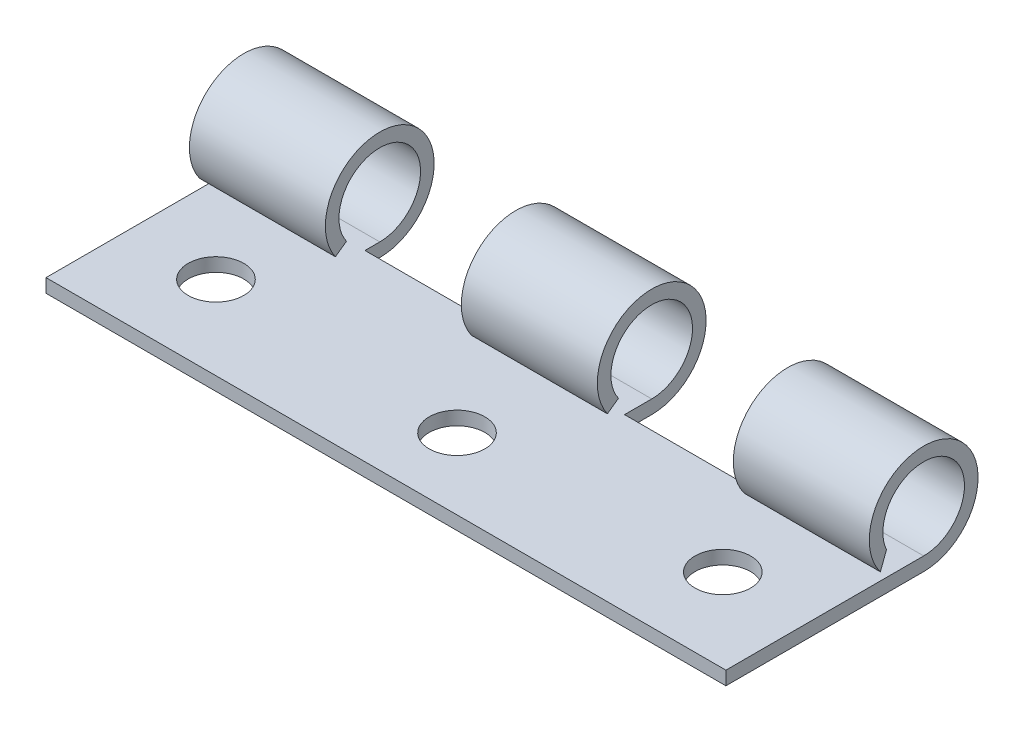
ISO-10303-21;
HEADER;
FILE_DESCRIPTION(('STEP AP214'),'2;1');
FILE_NAME('part.step','',(''),(''),'','','');
FILE_SCHEMA(('AUTOMOTIVE_DESIGN { 1 0 10303 214 1 1 1 1 }'));
ENDSEC;
DATA;
#1=APPLICATION_CONTEXT('core data for automotive mechanical design processes');
#2=APPLICATION_PROTOCOL_DEFINITION('international standard','automotive_design',2000,#1);
#3=PRODUCT_CONTEXT('',#1,'mechanical');
#4=PRODUCT('Part','Part','',(#3));
#5=PRODUCT_RELATED_PRODUCT_CATEGORY('part','',(#4));
#6=PRODUCT_DEFINITION_FORMATION('','',#4);
#7=PRODUCT_DEFINITION_CONTEXT('part definition',#1,'design');
#8=PRODUCT_DEFINITION('design','',#6,#7);
#9=PRODUCT_DEFINITION_SHAPE('','',#8);
#10=(LENGTH_UNIT() NAMED_UNIT(*) SI_UNIT(.MILLI.,.METRE.));
#11=(NAMED_UNIT(*) PLANE_ANGLE_UNIT() SI_UNIT($,.RADIAN.));
#12=(NAMED_UNIT(*) SI_UNIT($,.STERADIAN.) SOLID_ANGLE_UNIT());
#13=UNCERTAINTY_MEASURE_WITH_UNIT(LENGTH_MEASURE(1.E-05),#10,'distance_accuracy_value','');
#14=(GEOMETRIC_REPRESENTATION_CONTEXT(3) GLOBAL_UNCERTAINTY_ASSIGNED_CONTEXT((#13)) GLOBAL_UNIT_ASSIGNED_CONTEXT((#10,
#11,#12)) REPRESENTATION_CONTEXT('',''));
#15=CARTESIAN_POINT('',(0.,0.,0.));
#16=DIRECTION('',(0.,0.,1.));
#17=DIRECTION('',(1.,0.,0.));
#18=AXIS2_PLACEMENT_3D('',#15,#16,#17);
#19=CARTESIAN_POINT('',(12.0849999999999,4.4,-38.4175000000002));
#20=DIRECTION('',(1.,0.,0.));
#21=DIRECTION('',(0.,0.,-1.));
#22=AXIS2_PLACEMENT_3D('',#19,#20,#21);
#23=CYLINDRICAL_SURFACE('',#22,4.40000000000011);
#24=DIRECTION('',(1.,0.,0.));
#25=VECTOR('',#24,1.);
#26=CARTESIAN_POINT('',(12.0849999999999,1.85263157894761,-34.8298943740395));
#27=LINE('',#26,#25);
#28=CARTESIAN_POINT('',(12.0849999999999,1.85263157894761,-34.8298943740395));
#29=VERTEX_POINT('',#28);
#30=CARTESIAN_POINT('',(23.0849999999999,1.85263157894761,-34.8298943740395));
#31=VERTEX_POINT('',#30);
#32=EDGE_CURVE('E289',#29,#31,#27,.T.);
#33=ORIENTED_EDGE('',*,*,#32,.T.);
#34=CARTESIAN_POINT('',(23.0849999999999,4.4,-38.4175000000002));
#35=DIRECTION('',(1.,0.,0.));
#36=DIRECTION('',(0.,0.,-1.));
#37=AXIS2_PLACEMENT_3D('',#34,#35,#36);
#38=CIRCLE('',#37,4.40000000000011);
#39=CARTESIAN_POINT('',(23.0849999999999,0.,-38.4175000000001));
#40=VERTEX_POINT('',#39);
#41=EDGE_CURVE('E66',#31,#40,#38,.F.);
#42=ORIENTED_EDGE('',*,*,#41,.T.);
#43=DIRECTION('',(1.,0.,0.));
#44=VECTOR('',#43,1.);
#45=CARTESIAN_POINT('',(12.0849999999999,-2.22044604925031E-13,-38.4175));
#46=LINE('',#45,#44);
#47=CARTESIAN_POINT('',(12.0849999999999,-2.22044604925031E-13,-38.4175));
#48=VERTEX_POINT('',#47);
#49=EDGE_CURVE('E274',#48,#40,#46,.T.);
#50=ORIENTED_EDGE('',*,*,#49,.F.);
#51=CARTESIAN_POINT('',(12.0849999999999,4.4,-38.4175000000002));
#52=DIRECTION('',(1.,0.,0.));
#53=DIRECTION('',(0.,0.,-1.));
#54=AXIS2_PLACEMENT_3D('',#51,#52,#53);
#55=CIRCLE('',#54,4.40000000000011);
#56=EDGE_CURVE('E244',#48,#29,#55,.T.);
#57=ORIENTED_EDGE('',*,*,#56,.T.);
#58=EDGE_LOOP('',(#33,#42,#50,#57));
#59=FACE_BOUND('',#58,.T.);
#60=ADVANCED_FACE('F43',(#59),#23,.T.);
#61=CARTESIAN_POINT('',(12.0849999999999,4.4,-38.4175000000002));
#62=DIRECTION('',(1.,0.,0.));
#63=DIRECTION('',(0.,0.,-1.));
#64=AXIS2_PLACEMENT_3D('',#61,#62,#63);
#65=CYLINDRICAL_SURFACE('',#64,3.3);
#66=CARTESIAN_POINT('',(23.0849999999999,4.40000000000005,-38.4175000000003));
#67=DIRECTION('',(1.,0.,0.));
#68=DIRECTION('',(0.,0.,-1.));
#69=AXIS2_PLACEMENT_3D('',#66,#67,#68);
#70=CIRCLE('',#69,3.3);
#71=CARTESIAN_POINT('',(23.0849999999999,1.10000000000005,-38.4175000000003));
#72=VERTEX_POINT('',#71);
#73=CARTESIAN_POINT('',(23.0849999999999,2.48947368421077,-35.7267957805296));
#74=VERTEX_POINT('',#73);
#75=EDGE_CURVE('E230',#72,#74,#70,.T.);
#76=ORIENTED_EDGE('',*,*,#75,.T.);
#77=DIRECTION('',(1.,0.,0.));
#78=VECTOR('',#77,1.);
#79=CARTESIAN_POINT('',(12.0849999999999,2.48947368421076,-35.7267957805296));
#80=LINE('',#79,#78);
#81=CARTESIAN_POINT('',(12.0849999999999,2.48947368421076,-35.7267957805296));
#82=VERTEX_POINT('',#81);
#83=EDGE_CURVE('E285',#82,#74,#80,.T.);
#84=ORIENTED_EDGE('',*,*,#83,.F.);
#85=CARTESIAN_POINT('',(12.0849999999999,4.4,-38.4175000000002));
#86=DIRECTION('',(-1.,0.,0.));
#87=DIRECTION('',(0.,0.,1.));
#88=AXIS2_PLACEMENT_3D('',#85,#86,#87);
#89=CIRCLE('',#88,3.3);
#90=CARTESIAN_POINT('',(12.0849999999999,1.09999999999999,-38.4175000000002));
#91=VERTEX_POINT('',#90);
#92=EDGE_CURVE('E251',#82,#91,#89,.T.);
#93=ORIENTED_EDGE('',*,*,#92,.T.);
#94=DIRECTION('',(1.,0.,0.));
#95=VECTOR('',#94,1.);
#96=CARTESIAN_POINT('',(12.0849999999999,1.09999999999999,-38.4175000000002));
#97=LINE('',#96,#95);
#98=EDGE_CURVE('E281',#91,#72,#97,.T.);
#99=ORIENTED_EDGE('',*,*,#98,.T.);
#100=EDGE_LOOP('',(#76,#84,#93,#99));
#101=FACE_BOUND('',#100,.T.);
#102=ADVANCED_FACE('F311',(#101),#65,.F.);
#103=CARTESIAN_POINT('',(12.0849999999999,1.85263157894761,-34.8298943740395));
#104=DIRECTION('',(0.,-0.815364914991039,-0.578947368421046));
#105=DIRECTION('',(0.,0.578947368421047,-0.81536491499104));
#106=AXIS2_PLACEMENT_3D('',#103,#104,#105);
#107=PLANE('',#106);
#108=ORIENTED_EDGE('',*,*,#83,.T.);
#109=DIRECTION('',(0.,-0.578947368421047,0.81536491499104));
#110=VECTOR('',#109,1.);
#111=CARTESIAN_POINT('',(23.0849999999999,1.85263157894761,-34.8298943740395));
#112=LINE('',#111,#110);
#113=EDGE_CURVE('E51',#74,#31,#112,.T.);
#114=ORIENTED_EDGE('',*,*,#113,.T.);
#115=ORIENTED_EDGE('',*,*,#32,.F.);
#116=DIRECTION('',(0.,0.578947368421046,-0.815364914991039));
#117=VECTOR('',#116,1.);
#118=CARTESIAN_POINT('',(12.0849999999999,1.85263157894761,-34.8298943740395));
#119=LINE('',#118,#117);
#120=EDGE_CURVE('E247',#29,#82,#119,.T.);
#121=ORIENTED_EDGE('',*,*,#120,.T.);
#122=EDGE_LOOP('',(#108,#114,#115,#121));
#123=FACE_BOUND('',#122,.T.);
#124=ADVANCED_FACE('F292',(#123),#107,.T.);
#125=CARTESIAN_POINT('',(34.0849999999999,4.4,-38.4175000000002));
#126=DIRECTION('',(1.,0.,0.));
#127=DIRECTION('',(0.,0.,-1.));
#128=AXIS2_PLACEMENT_3D('',#125,#126,#127);
#129=CIRCLE('',#128,4.40000000000011);
#130=CARTESIAN_POINT('',(34.0849999999999,1.85263157894761,-34.8298943740395));
#131=VERTEX_POINT('',#130);
#132=CARTESIAN_POINT('',(34.0849999999999,0.,-38.4175000000001));
#133=VERTEX_POINT('',#132);
#134=EDGE_CURVE('E241',#131,#133,#129,.F.);
#135=ORIENTED_EDGE('',*,*,#134,.F.);
#136=CARTESIAN_POINT('',(45.0849999999999,1.85263157894761,-34.8298943740395));
#137=VERTEX_POINT('',#136);
#138=EDGE_CURVE('E262',#131,#137,#27,.T.);
#139=ORIENTED_EDGE('',*,*,#138,.T.);
#140=CARTESIAN_POINT('',(45.0849999999999,4.4,-38.4175000000002));
#141=DIRECTION('',(1.,0.,0.));
#142=DIRECTION('',(0.,0.,-1.));
#143=AXIS2_PLACEMENT_3D('',#140,#141,#142);
#144=CIRCLE('',#143,4.40000000000011);
#145=CARTESIAN_POINT('',(45.0849999999999,-2.22044604925031E-13,-38.4175));
#146=VERTEX_POINT('',#145);
#147=EDGE_CURVE('E243',#146,#137,#144,.T.);
#148=ORIENTED_EDGE('',*,*,#147,.F.);
#149=EDGE_CURVE('E277',#133,#146,#46,.T.);
#150=ORIENTED_EDGE('',*,*,#149,.F.);
#151=EDGE_LOOP('',(#135,#139,#148,#150));
#152=FACE_BOUND('',#151,.T.);
#153=ADVANCED_FACE('F45',(#152),#23,.T.);
#154=CARTESIAN_POINT('',(12.0849999999999,0.,-22.4175000000002));
#155=DIRECTION('',(0.,-1.,0.));
#156=DIRECTION('',(0.,0.,-1.));
#157=AXIS2_PLACEMENT_3D('',#154,#155,#156);
#158=PLANE('',#157);
#159=CARTESIAN_POINT('',(39.5849999999999,0.,-28.1675000000002));
#160=DIRECTION('',(0.,-1.,0.));
#161=DIRECTION('',(0.,0.,-1.));
#162=AXIS2_PLACEMENT_3D('',#159,#160,#161);
#163=CIRCLE('',#162,2.25);
#164=CARTESIAN_POINT('',(39.5849999999999,-1.1354623404708E-13,-30.4175000000002));
#165=VERTEX_POINT('',#164);
#166=EDGE_CURVE('E372',#165,#165,#163,.T.);
#167=ORIENTED_EDGE('',*,*,#166,.F.);
#168=EDGE_LOOP('',(#167));
#169=FACE_BOUND('',#168,.T.);
#170=CARTESIAN_POINT('',(19.0849999999999,0.,-29.1675000000002));
#171=DIRECTION('',(0.,-1.,0.));
#172=DIRECTION('',(0.,0.,-1.));
#173=AXIS2_PLACEMENT_3D('',#170,#171,#172);
#174=CIRCLE('',#173,2.25);
#175=CARTESIAN_POINT('',(19.0849999999999,-1.27207181420397E-13,-31.4175000000002));
#176=VERTEX_POINT('',#175);
#177=EDGE_CURVE('E366',#176,#176,#174,.T.);
#178=ORIENTED_EDGE('',*,*,#177,.F.);
#179=EDGE_LOOP('',(#178));
#180=FACE_BOUND('',#179,.T.);
#181=CARTESIAN_POINT('',(60.0849999999999,0.,-29.1675000000002));
#182=DIRECTION('',(0.,-1.,0.));
#183=DIRECTION('',(0.,0.,-1.));
#184=AXIS2_PLACEMENT_3D('',#181,#182,#183);
#185=CIRCLE('',#184,2.25);
#186=CARTESIAN_POINT('',(60.0849999999999,-1.27207181420397E-13,-31.4175000000002));
#187=VERTEX_POINT('',#186);
#188=EDGE_CURVE('E354',#187,#187,#185,.T.);
#189=ORIENTED_EDGE('',*,*,#188,.F.);
#190=EDGE_LOOP('',(#189));
#191=FACE_BOUND('',#190,.T.);
#192=DIRECTION('',(0.,0.,1.));
#193=VECTOR('',#192,1.);
#194=CARTESIAN_POINT('',(34.0849999999999,0.,-38.4175000000001));
#195=LINE('',#194,#193);
#196=CARTESIAN_POINT('',(34.0849999999999,0.,-37.2175000000002));
#197=VERTEX_POINT('',#196);
#198=EDGE_CURVE('E221',#133,#197,#195,.T.);
#199=ORIENTED_EDGE('',*,*,#198,.F.);
#200=ORIENTED_EDGE('',*,*,#149,.T.);
#201=DIRECTION('',(0.,0.,-1.));
#202=VECTOR('',#201,1.);
#203=CARTESIAN_POINT('',(45.0849999999999,0.,-22.4175000000002));
#204=LINE('',#203,#202);
#205=CARTESIAN_POINT('',(45.0849999999999,-1.92225953904445E-13,-36.2175));
#206=VERTEX_POINT('',#205);
#207=EDGE_CURVE('E248',#206,#146,#204,.T.);
#208=ORIENTED_EDGE('',*,*,#207,.F.);
#209=DIRECTION('',(-1.,0.,0.));
#210=VECTOR('',#209,1.);
#211=CARTESIAN_POINT('',(56.0849999999999,0.,-36.2175));
#212=LINE('',#211,#210);
#213=CARTESIAN_POINT('',(56.0849999999999,0.,-36.2175));
#214=VERTEX_POINT('',#213);
#215=EDGE_CURVE('E210',#214,#206,#212,.T.);
#216=ORIENTED_EDGE('',*,*,#215,.F.);
#217=DIRECTION('',(0.,0.,-1.));
#218=VECTOR('',#217,1.);
#219=CARTESIAN_POINT('',(56.0849999999999,0.,-38.4175));
#220=LINE('',#219,#218);
#221=CARTESIAN_POINT('',(56.0849999999999,0.,-38.4175));
#222=VERTEX_POINT('',#221);
#223=EDGE_CURVE('E336',#214,#222,#220,.T.);
#224=ORIENTED_EDGE('',*,*,#223,.T.);
#225=DIRECTION('',(-1.,0.,0.));
#226=VECTOR('',#225,1.);
#227=CARTESIAN_POINT('',(67.0849999999999,0.,-38.4175));
#228=LINE('',#227,#226);
#229=CARTESIAN_POINT('',(67.0849999999999,0.,-38.4175));
#230=VERTEX_POINT('',#229);
#231=EDGE_CURVE('E196',#230,#222,#228,.T.);
#232=ORIENTED_EDGE('',*,*,#231,.F.);
#233=DIRECTION('',(0.,0.,-1.));
#234=VECTOR('',#233,1.);
#235=CARTESIAN_POINT('',(67.0849999999999,0.,-38.4175));
#236=LINE('',#235,#234);
#237=CARTESIAN_POINT('',(67.0849999999999,0.,-22.4175));
#238=VERTEX_POINT('',#237);
#239=EDGE_CURVE('E306',#238,#230,#236,.T.);
#240=ORIENTED_EDGE('',*,*,#239,.F.);
#241=DIRECTION('',(1.,0.,0.));
#242=VECTOR('',#241,1.);
#243=CARTESIAN_POINT('',(12.0849999999999,0.,-22.4175000000002));
#244=LINE('',#243,#242);
#245=CARTESIAN_POINT('',(12.0849999999999,0.,-22.4175000000002));
#246=VERTEX_POINT('',#245);
#247=EDGE_CURVE('E278',#246,#238,#244,.T.);
#248=ORIENTED_EDGE('',*,*,#247,.F.);
#249=DIRECTION('',(0.,0.,-1.));
#250=VECTOR('',#249,1.);
#251=CARTESIAN_POINT('',(12.0849999999999,0.,-22.4175000000002));
#252=LINE('',#251,#250);
#253=EDGE_CURVE('E259',#246,#48,#252,.T.);
#254=ORIENTED_EDGE('',*,*,#253,.T.);
#255=ORIENTED_EDGE('',*,*,#49,.T.);
#256=DIRECTION('',(0.,0.,1.));
#257=VECTOR('',#256,1.);
#258=CARTESIAN_POINT('',(23.0849999999999,0.,-38.4175000000001));
#259=LINE('',#258,#257);
#260=CARTESIAN_POINT('',(23.0849999999999,0.,-37.2175000000002));
#261=VERTEX_POINT('',#260);
#262=EDGE_CURVE('E218',#40,#261,#259,.T.);
#263=ORIENTED_EDGE('',*,*,#262,.T.);
#264=DIRECTION('',(-1.,0.,0.));
#265=VECTOR('',#264,1.);
#266=CARTESIAN_POINT('',(34.0849999999999,0.,-37.2175000000002));
#267=LINE('',#266,#265);
#268=EDGE_CURVE('E234',#197,#261,#267,.T.);
#269=ORIENTED_EDGE('',*,*,#268,.F.);
#270=EDGE_LOOP('',(#199,#200,#208,#216,#224,#232,#240,#248,#254,#255,#263,#269));
#271=FACE_BOUND('',#270,.T.);
#272=ADVANCED_FACE('F303',(#169,#180,#191,#271),#158,.T.);
#273=CARTESIAN_POINT('',(12.0849999999999,1.09999999999999,-22.4175000000002));
#274=DIRECTION('',(0.,0.,1.));
#275=DIRECTION('',(1.,0.,0.));
#276=AXIS2_PLACEMENT_3D('',#273,#274,#275);
#277=PLANE('',#276);
#278=ORIENTED_EDGE('',*,*,#247,.T.);
#279=DIRECTION('',(0.,-1.,0.));
#280=VECTOR('',#279,1.);
#281=CARTESIAN_POINT('',(67.0849999999999,0.,-22.4175));
#282=LINE('',#281,#280);
#283=CARTESIAN_POINT('',(67.0849999999999,1.1,-22.4175));
#284=VERTEX_POINT('',#283);
#285=EDGE_CURVE('E181',#284,#238,#282,.T.);
#286=ORIENTED_EDGE('',*,*,#285,.F.);
#287=DIRECTION('',(1.,0.,0.));
#288=VECTOR('',#287,1.);
#289=CARTESIAN_POINT('',(12.0849999999999,1.09999999999999,-22.4175000000002));
#290=LINE('',#289,#288);
#291=CARTESIAN_POINT('',(12.0849999999999,1.09999999999999,-22.4175000000002));
#292=VERTEX_POINT('',#291);
#293=EDGE_CURVE('E177',#292,#284,#290,.T.);
#294=ORIENTED_EDGE('',*,*,#293,.F.);
#295=DIRECTION('',(0.,-1.,0.));
#296=VECTOR('',#295,1.);
#297=CARTESIAN_POINT('',(12.0849999999999,1.09999999999999,-22.4175000000002));
#298=LINE('',#297,#296);
#299=EDGE_CURVE('E256',#292,#246,#298,.T.);
#300=ORIENTED_EDGE('',*,*,#299,.T.);
#301=EDGE_LOOP('',(#278,#286,#294,#300));
#302=FACE_BOUND('',#301,.T.);
#303=ADVANCED_FACE('F308',(#302),#277,.T.);
#304=CARTESIAN_POINT('',(12.0849999999999,1.09999999999999,-38.4175000000002));
#305=DIRECTION('',(0.,1.,0.));
#306=DIRECTION('',(0.,0.,1.));
#307=AXIS2_PLACEMENT_3D('',#304,#305,#306);
#308=PLANE('',#307);
#309=CARTESIAN_POINT('',(39.5849999999999,1.09999999999979,-28.1675000000002));
#310=DIRECTION('',(0.,1.,0.));
#311=DIRECTION('',(0.,0.,1.));
#312=AXIS2_PLACEMENT_3D('',#309,#310,#311);
#313=CIRCLE('',#312,2.25);
#314=CARTESIAN_POINT('',(39.5849999999999,1.09999999999981,-25.9175000000002));
#315=VERTEX_POINT('',#314);
#316=EDGE_CURVE('E375',#315,#315,#313,.T.);
#317=ORIENTED_EDGE('',*,*,#316,.F.);
#318=EDGE_LOOP('',(#317));
#319=FACE_BOUND('',#318,.T.);
#320=CARTESIAN_POINT('',(19.0849999999999,1.09999999999978,-29.1675000000002));
#321=DIRECTION('',(0.,1.,0.));
#322=DIRECTION('',(0.,0.,1.));
#323=AXIS2_PLACEMENT_3D('',#320,#321,#322);
#324=CIRCLE('',#323,2.25);
#325=CARTESIAN_POINT('',(19.0849999999999,1.0999999999998,-26.9175000000002));
#326=VERTEX_POINT('',#325);
#327=EDGE_CURVE('E369',#326,#326,#324,.T.);
#328=ORIENTED_EDGE('',*,*,#327,.F.);
#329=EDGE_LOOP('',(#328));
#330=FACE_BOUND('',#329,.T.);
#331=CARTESIAN_POINT('',(60.0849999999999,1.09999999999978,-29.1675000000002));
#332=DIRECTION('',(0.,1.,0.));
#333=DIRECTION('',(0.,0.,1.));
#334=AXIS2_PLACEMENT_3D('',#331,#332,#333);
#335=CIRCLE('',#334,2.25);
#336=CARTESIAN_POINT('',(60.0849999999999,1.0999999999998,-26.9175000000002));
#337=VERTEX_POINT('',#336);
#338=EDGE_CURVE('E356',#337,#337,#335,.T.);
#339=ORIENTED_EDGE('',*,*,#338,.F.);
#340=EDGE_LOOP('',(#339));
#341=FACE_BOUND('',#340,.T.);
#342=DIRECTION('',(0.,0.,-1.));
#343=VECTOR('',#342,1.);
#344=CARTESIAN_POINT('',(34.0849999999999,1.10000000000005,-37.2175000000002));
#345=LINE('',#344,#343);
#346=CARTESIAN_POINT('',(34.0849999999999,1.10000000000005,-37.2175000000002));
#347=VERTEX_POINT('',#346);
#348=CARTESIAN_POINT('',(34.0849999999999,1.10000000000005,-38.4175000000003));
#349=VERTEX_POINT('',#348);
#350=EDGE_CURVE('E217',#347,#349,#345,.T.);
#351=ORIENTED_EDGE('',*,*,#350,.F.);
#352=DIRECTION('',(-1.,0.,0.));
#353=VECTOR('',#352,1.);
#354=CARTESIAN_POINT('',(34.0849999999999,1.10000000000005,-37.2175000000002));
#355=LINE('',#354,#353);
#356=CARTESIAN_POINT('',(23.0849999999999,1.10000000000005,-37.2175000000002));
#357=VERTEX_POINT('',#356);
#358=EDGE_CURVE('E224',#347,#357,#355,.T.);
#359=ORIENTED_EDGE('',*,*,#358,.T.);
#360=DIRECTION('',(0.,0.,-1.));
#361=VECTOR('',#360,1.);
#362=CARTESIAN_POINT('',(23.0849999999999,1.10000000000005,-37.2175000000002));
#363=LINE('',#362,#361);
#364=EDGE_CURVE('E227',#357,#72,#363,.T.);
#365=ORIENTED_EDGE('',*,*,#364,.T.);
#366=ORIENTED_EDGE('',*,*,#98,.F.);
#367=DIRECTION('',(0.,0.,1.));
#368=VECTOR('',#367,1.);
#369=CARTESIAN_POINT('',(12.0849999999999,1.09999999999999,-38.4175000000002));
#370=LINE('',#369,#368);
#371=EDGE_CURVE('E254',#91,#292,#370,.T.);
#372=ORIENTED_EDGE('',*,*,#371,.T.);
#373=ORIENTED_EDGE('',*,*,#293,.T.);
#374=DIRECTION('',(0.,0.,1.));
#375=VECTOR('',#374,1.);
#376=CARTESIAN_POINT('',(67.0849999999999,1.1,-22.4175));
#377=LINE('',#376,#375);
#378=CARTESIAN_POINT('',(67.0849999999999,1.1,-38.4175));
#379=VERTEX_POINT('',#378);
#380=EDGE_CURVE('E168',#379,#284,#377,.T.);
#381=ORIENTED_EDGE('',*,*,#380,.F.);
#382=DIRECTION('',(-1.,0.,0.));
#383=VECTOR('',#382,1.);
#384=CARTESIAN_POINT('',(67.0849999999999,1.1,-38.4175));
#385=LINE('',#384,#383);
#386=CARTESIAN_POINT('',(56.0849999999999,1.1,-38.4175));
#387=VERTEX_POINT('',#386);
#388=EDGE_CURVE('E174',#379,#387,#385,.T.);
#389=ORIENTED_EDGE('',*,*,#388,.T.);
#390=DIRECTION('',(0.,0.,1.));
#391=VECTOR('',#390,1.);
#392=CARTESIAN_POINT('',(56.0849999999999,1.1,-22.4175));
#393=LINE('',#392,#391);
#394=CARTESIAN_POINT('',(56.0849999999999,1.1,-36.2175));
#395=VERTEX_POINT('',#394);
#396=EDGE_CURVE('E340',#387,#395,#393,.T.);
#397=ORIENTED_EDGE('',*,*,#396,.T.);
#398=DIRECTION('',(-1.,0.,0.));
#399=VECTOR('',#398,1.);
#400=CARTESIAN_POINT('',(56.0849999999999,1.1,-36.2175));
#401=LINE('',#400,#399);
#402=CARTESIAN_POINT('',(45.0849999999999,1.1,-36.2175));
#403=VERTEX_POINT('',#402);
#404=EDGE_CURVE('E206',#395,#403,#401,.T.);
#405=ORIENTED_EDGE('',*,*,#404,.T.);
#406=DIRECTION('',(0.,0.,1.));
#407=VECTOR('',#406,1.);
#408=CARTESIAN_POINT('',(45.0849999999999,1.09999999999999,-38.4175000000002));
#409=LINE('',#408,#407);
#410=CARTESIAN_POINT('',(45.0849999999999,1.09999999999999,-38.4175000000002));
#411=VERTEX_POINT('',#410);
#412=EDGE_CURVE('E271',#411,#403,#409,.T.);
#413=ORIENTED_EDGE('',*,*,#412,.F.);
#414=EDGE_CURVE('E284',#349,#411,#97,.T.);
#415=ORIENTED_EDGE('',*,*,#414,.F.);
#416=EDGE_LOOP('',(#351,#359,#365,#366,#372,#373,#381,#389,#397,#405,#413,#415));
#417=FACE_BOUND('',#416,.T.);
#418=ADVANCED_FACE('F171',(#319,#330,#341,#417),#308,.T.);
#419=CARTESIAN_POINT('',(34.0849999999999,4.4,-38.4175000000002));
#420=DIRECTION('',(1.,0.,0.));
#421=DIRECTION('',(0.,0.,-1.));
#422=AXIS2_PLACEMENT_3D('',#419,#420,#421);
#423=CIRCLE('',#422,3.3);
#424=CARTESIAN_POINT('',(34.0849999999999,2.48947368421077,-35.7267957805296));
#425=VERTEX_POINT('',#424);
#426=EDGE_CURVE('E239',#349,#425,#423,.T.);
#427=ORIENTED_EDGE('',*,*,#426,.F.);
#428=ORIENTED_EDGE('',*,*,#414,.T.);
#429=CARTESIAN_POINT('',(45.0849999999999,4.4,-38.4175000000002));
#430=DIRECTION('',(-1.,0.,0.));
#431=DIRECTION('',(0.,0.,1.));
#432=AXIS2_PLACEMENT_3D('',#429,#430,#431);
#433=CIRCLE('',#432,3.3);
#434=CARTESIAN_POINT('',(45.0849999999999,2.48947368421076,-35.7267957805296));
#435=VERTEX_POINT('',#434);
#436=EDGE_CURVE('E268',#435,#411,#433,.T.);
#437=ORIENTED_EDGE('',*,*,#436,.F.);
#438=EDGE_CURVE('E288',#425,#435,#80,.T.);
#439=ORIENTED_EDGE('',*,*,#438,.F.);
#440=EDGE_LOOP('',(#427,#428,#437,#439));
#441=FACE_BOUND('',#440,.T.);
#442=ADVANCED_FACE('F383',(#441),#65,.F.);
#443=DIRECTION('',(0.,-0.578947368421047,0.81536491499104));
#444=VECTOR('',#443,1.);
#445=CARTESIAN_POINT('',(34.0849999999999,1.85263157894761,-34.8298943740395));
#446=LINE('',#445,#444);
#447=EDGE_CURVE('E11',#425,#131,#446,.T.);
#448=ORIENTED_EDGE('',*,*,#447,.F.);
#449=ORIENTED_EDGE('',*,*,#438,.T.);
#450=DIRECTION('',(0.,0.578947368421046,-0.815364914991039));
#451=VECTOR('',#450,1.);
#452=CARTESIAN_POINT('',(45.0849999999999,1.85263157894761,-34.8298943740395));
#453=LINE('',#452,#451);
#454=EDGE_CURVE('E265',#137,#435,#453,.T.);
#455=ORIENTED_EDGE('',*,*,#454,.F.);
#456=ORIENTED_EDGE('',*,*,#138,.F.);
#457=EDGE_LOOP('',(#448,#449,#455,#456));
#458=FACE_BOUND('',#457,.T.);
#459=ADVANCED_FACE('F415',(#458),#107,.T.);
#460=CARTESIAN_POINT('',(12.0849999999999,4.4,-38.4175000000002));
#461=DIRECTION('',(1.,0.,0.));
#462=DIRECTION('',(0.,0.,-1.));
#463=AXIS2_PLACEMENT_3D('',#460,#461,#462);
#464=PLANE('',#463);
#465=ORIENTED_EDGE('',*,*,#56,.F.);
#466=ORIENTED_EDGE('',*,*,#253,.F.);
#467=ORIENTED_EDGE('',*,*,#299,.F.);
#468=ORIENTED_EDGE('',*,*,#371,.F.);
#469=ORIENTED_EDGE('',*,*,#92,.F.);
#470=ORIENTED_EDGE('',*,*,#120,.F.);
#471=EDGE_LOOP('',(#465,#466,#467,#468,#469,#470));
#472=FACE_BOUND('',#471,.T.);
#473=ADVANCED_FACE('F298',(#472),#464,.F.);
#474=CARTESIAN_POINT('',(45.0849999999999,4.4,-38.4175000000002));
#475=DIRECTION('',(1.,0.,0.));
#476=DIRECTION('',(0.,0.,-1.));
#477=AXIS2_PLACEMENT_3D('',#474,#475,#476);
#478=PLANE('',#477);
#479=DIRECTION('',(0.,1.,0.));
#480=VECTOR('',#479,1.);
#481=CARTESIAN_POINT('',(45.0849999999999,1.1,-36.2175));
#482=LINE('',#481,#480);
#483=EDGE_CURVE('E58',#206,#403,#482,.T.);
#484=ORIENTED_EDGE('',*,*,#483,.F.);
#485=ORIENTED_EDGE('',*,*,#207,.T.);
#486=ORIENTED_EDGE('',*,*,#147,.T.);
#487=ORIENTED_EDGE('',*,*,#454,.T.);
#488=ORIENTED_EDGE('',*,*,#436,.T.);
#489=ORIENTED_EDGE('',*,*,#412,.T.);
#490=EDGE_LOOP('',(#484,#485,#486,#487,#488,#489));
#491=FACE_BOUND('',#490,.T.);
#492=ADVANCED_FACE('F329',(#491),#478,.T.);
#493=CARTESIAN_POINT('',(34.0849999999999,0.,-37.2175000000002));
#494=DIRECTION('',(0.,0.,1.));
#495=DIRECTION('',(1.,0.,0.));
#496=AXIS2_PLACEMENT_3D('',#493,#494,#495);
#497=PLANE('',#496);
#498=DIRECTION('',(0.,1.,0.));
#499=VECTOR('',#498,1.);
#500=CARTESIAN_POINT('',(23.0849999999999,0.,-37.2175000000002));
#501=LINE('',#500,#499);
#502=EDGE_CURVE('E213',#261,#357,#501,.T.);
#503=ORIENTED_EDGE('',*,*,#502,.T.);
#504=ORIENTED_EDGE('',*,*,#358,.F.);
#505=DIRECTION('',(0.,1.,0.));
#506=VECTOR('',#505,1.);
#507=CARTESIAN_POINT('',(34.0849999999999,0.,-37.2175000000002));
#508=LINE('',#507,#506);
#509=EDGE_CURVE('E214',#197,#347,#508,.T.);
#510=ORIENTED_EDGE('',*,*,#509,.F.);
#511=ORIENTED_EDGE('',*,*,#268,.T.);
#512=EDGE_LOOP('',(#503,#504,#510,#511));
#513=FACE_BOUND('',#512,.T.);
#514=ADVANCED_FACE('F315',(#513),#497,.F.);
#515=CARTESIAN_POINT('',(34.0849999999999,4.40000000000005,-38.4175000000003));
#516=DIRECTION('',(1.,0.,0.));
#517=DIRECTION('',(0.,0.,-1.));
#518=AXIS2_PLACEMENT_3D('',#515,#516,#517);
#519=PLANE('',#518);
#520=ORIENTED_EDGE('',*,*,#134,.T.);
#521=ORIENTED_EDGE('',*,*,#198,.T.);
#522=ORIENTED_EDGE('',*,*,#509,.T.);
#523=ORIENTED_EDGE('',*,*,#350,.T.);
#524=ORIENTED_EDGE('',*,*,#426,.T.);
#525=ORIENTED_EDGE('',*,*,#447,.T.);
#526=EDGE_LOOP('',(#520,#521,#522,#523,#524,#525));
#527=FACE_BOUND('',#526,.T.);
#528=ADVANCED_FACE('F320',(#527),#519,.F.);
#529=CARTESIAN_POINT('',(23.0849999999999,4.40000000000005,-38.4175000000003));
#530=DIRECTION('',(1.,0.,0.));
#531=DIRECTION('',(0.,0.,-1.));
#532=AXIS2_PLACEMENT_3D('',#529,#530,#531);
#533=PLANE('',#532);
#534=ORIENTED_EDGE('',*,*,#113,.F.);
#535=ORIENTED_EDGE('',*,*,#75,.F.);
#536=ORIENTED_EDGE('',*,*,#364,.F.);
#537=ORIENTED_EDGE('',*,*,#502,.F.);
#538=ORIENTED_EDGE('',*,*,#262,.F.);
#539=ORIENTED_EDGE('',*,*,#41,.F.);
#540=EDGE_LOOP('',(#534,#535,#536,#537,#538,#539));
#541=FACE_BOUND('',#540,.T.);
#542=ADVANCED_FACE('F312',(#541),#533,.T.);
#543=CARTESIAN_POINT('',(56.0849999999999,1.1,-36.2175));
#544=DIRECTION('',(0.,0.,1.));
#545=DIRECTION('',(1.,0.,0.));
#546=AXIS2_PLACEMENT_3D('',#543,#544,#545);
#547=PLANE('',#546);
#548=ORIENTED_EDGE('',*,*,#483,.T.);
#549=ORIENTED_EDGE('',*,*,#404,.F.);
#550=DIRECTION('',(0.,1.,0.));
#551=VECTOR('',#550,1.);
#552=CARTESIAN_POINT('',(56.0849999999999,1.1,-36.2175));
#553=LINE('',#552,#551);
#554=EDGE_CURVE('E198',#214,#395,#553,.T.);
#555=ORIENTED_EDGE('',*,*,#554,.F.);
#556=ORIENTED_EDGE('',*,*,#215,.T.);
#557=EDGE_LOOP('',(#548,#549,#555,#556));
#558=FACE_BOUND('',#557,.T.);
#559=ADVANCED_FACE('F332',(#558),#547,.F.);
#560=CARTESIAN_POINT('',(56.0849999999999,4.4,-38.4175));
#561=DIRECTION('',(1.,0.,0.));
#562=DIRECTION('',(0.,0.,-1.));
#563=AXIS2_PLACEMENT_3D('',#560,#561,#562);
#564=PLANE('',#563);
#565=ORIENTED_EDGE('',*,*,#223,.F.);
#566=ORIENTED_EDGE('',*,*,#554,.T.);
#567=ORIENTED_EDGE('',*,*,#396,.F.);
#568=CARTESIAN_POINT('',(56.0849999999999,4.4,-38.4175));
#569=DIRECTION('',(-1.,0.,0.));
#570=DIRECTION('',(0.,0.,-1.));
#571=AXIS2_PLACEMENT_3D('',#568,#569,#570);
#572=CIRCLE('',#571,3.3);
#573=CARTESIAN_POINT('',(56.0849999999999,3.04634613085817,-35.4079117885403));
#574=VERTEX_POINT('',#573);
#575=EDGE_CURVE('E195',#574,#387,#572,.T.);
#576=ORIENTED_EDGE('',*,*,#575,.F.);
#577=DIRECTION('',(0.,0.936383741587994,-0.350977903135893));
#578=VECTOR('',#577,1.);
#579=CARTESIAN_POINT('',(56.0849999999999,3.04634613085817,-35.4079117885403));
#580=LINE('',#579,#578);
#581=CARTESIAN_POINT('',(56.0849999999999,1.73499999999983,-34.9163894618994));
#582=VERTEX_POINT('',#581);
#583=EDGE_CURVE('E191',#582,#574,#580,.T.);
#584=ORIENTED_EDGE('',*,*,#583,.F.);
#585=CARTESIAN_POINT('',(56.0849999999999,4.4,-38.4175));
#586=DIRECTION('',(1.,0.,0.));
#587=DIRECTION('',(0.,0.,1.));
#588=AXIS2_PLACEMENT_3D('',#585,#586,#587);
#589=CIRCLE('',#588,4.4);
#590=EDGE_CURVE('E339',#222,#582,#589,.T.);
#591=ORIENTED_EDGE('',*,*,#590,.F.);
#592=EDGE_LOOP('',(#565,#566,#567,#576,#584,#591));
#593=FACE_BOUND('',#592,.T.);
#594=ADVANCED_FACE('F337',(#593),#564,.F.);
#595=CARTESIAN_POINT('',(67.0849999999999,4.4,-38.4175));
#596=DIRECTION('',(-1.,0.,0.));
#597=DIRECTION('',(0.,0.,1.));
#598=AXIS2_PLACEMENT_3D('',#595,#596,#597);
#599=CYLINDRICAL_SURFACE('',#598,3.3);
#600=ORIENTED_EDGE('',*,*,#575,.T.);
#601=ORIENTED_EDGE('',*,*,#388,.F.);
#602=CARTESIAN_POINT('',(67.0849999999999,4.4,-38.4175));
#603=DIRECTION('',(-1.,0.,0.));
#604=DIRECTION('',(0.,0.,-1.));
#605=AXIS2_PLACEMENT_3D('',#602,#603,#604);
#606=CIRCLE('',#605,3.3);
#607=CARTESIAN_POINT('',(67.0849999999999,3.04634613085817,-35.4079117885403));
#608=VERTEX_POINT('',#607);
#609=EDGE_CURVE('E182',#608,#379,#606,.T.);
#610=ORIENTED_EDGE('',*,*,#609,.F.);
#611=DIRECTION('',(-1.,0.,0.));
#612=VECTOR('',#611,1.);
#613=CARTESIAN_POINT('',(67.0849999999999,3.04634613085817,-35.4079117885403));
#614=LINE('',#613,#612);
#615=EDGE_CURVE('E347',#608,#574,#614,.T.);
#616=ORIENTED_EDGE('',*,*,#615,.T.);
#617=EDGE_LOOP('',(#600,#601,#610,#616));
#618=FACE_BOUND('',#617,.T.);
#619=ADVANCED_FACE('F193',(#618),#599,.F.);
#620=CARTESIAN_POINT('',(67.0849999999999,4.4,-38.4175));
#621=DIRECTION('',(-1.,0.,0.));
#622=DIRECTION('',(0.,0.,1.));
#623=AXIS2_PLACEMENT_3D('',#620,#621,#622);
#624=CYLINDRICAL_SURFACE('',#623,4.4);
#625=ORIENTED_EDGE('',*,*,#590,.T.);
#626=DIRECTION('',(-1.,0.,0.));
#627=VECTOR('',#626,1.);
#628=CARTESIAN_POINT('',(67.0849999999999,1.73499999999983,-34.9163894618994));
#629=LINE('',#628,#627);
#630=CARTESIAN_POINT('',(67.0849999999999,1.73499999999983,-34.9163894618994));
#631=VERTEX_POINT('',#630);
#632=EDGE_CURVE('E201',#631,#582,#629,.T.);
#633=ORIENTED_EDGE('',*,*,#632,.F.);
#634=CARTESIAN_POINT('',(67.0849999999999,4.4,-38.4175));
#635=DIRECTION('',(1.,0.,0.));
#636=DIRECTION('',(0.,0.,1.));
#637=AXIS2_PLACEMENT_3D('',#634,#635,#636);
#638=CIRCLE('',#637,4.4);
#639=EDGE_CURVE('E360',#230,#631,#638,.T.);
#640=ORIENTED_EDGE('',*,*,#639,.F.);
#641=ORIENTED_EDGE('',*,*,#231,.T.);
#642=EDGE_LOOP('',(#625,#633,#640,#641));
#643=FACE_BOUND('',#642,.T.);
#644=ADVANCED_FACE('F443',(#643),#624,.T.);
#645=CARTESIAN_POINT('',(67.0849999999999,3.04634613085817,-35.4079117885403));
#646=DIRECTION('',(0.,0.350977903135893,0.936383741587994));
#647=DIRECTION('',(0.,-0.936383741587994,0.350977903135893));
#648=AXIS2_PLACEMENT_3D('',#645,#646,#647);
#649=PLANE('',#648);
#650=ORIENTED_EDGE('',*,*,#583,.T.);
#651=ORIENTED_EDGE('',*,*,#615,.F.);
#652=DIRECTION('',(0.,0.936383741587994,-0.350977903135893));
#653=VECTOR('',#652,1.);
#654=CARTESIAN_POINT('',(67.0849999999999,3.04634613085817,-35.4079117885403));
#655=LINE('',#654,#653);
#656=EDGE_CURVE('E187',#631,#608,#655,.T.);
#657=ORIENTED_EDGE('',*,*,#656,.F.);
#658=ORIENTED_EDGE('',*,*,#632,.T.);
#659=EDGE_LOOP('',(#650,#651,#657,#658));
#660=FACE_BOUND('',#659,.T.);
#661=ADVANCED_FACE('F351',(#660),#649,.F.);
#662=CARTESIAN_POINT('',(67.0849999999999,4.4,-38.4175));
#663=DIRECTION('',(1.,0.,0.));
#664=DIRECTION('',(0.,0.,-1.));
#665=AXIS2_PLACEMENT_3D('',#662,#663,#664);
#666=PLANE('',#665);
#667=ORIENTED_EDGE('',*,*,#609,.T.);
#668=ORIENTED_EDGE('',*,*,#380,.T.);
#669=ORIENTED_EDGE('',*,*,#285,.T.);
#670=ORIENTED_EDGE('',*,*,#239,.T.);
#671=ORIENTED_EDGE('',*,*,#639,.T.);
#672=ORIENTED_EDGE('',*,*,#656,.T.);
#673=EDGE_LOOP('',(#667,#668,#669,#670,#671,#672));
#674=FACE_BOUND('',#673,.T.);
#675=ADVANCED_FACE('F185',(#674),#666,.T.);
#676=CARTESIAN_POINT('',(60.0849999999999,1.09999999999978,-29.1675000000002));
#677=DIRECTION('',(0.,1.,0.));
#678=DIRECTION('',(0.,0.,1.));
#679=AXIS2_PLACEMENT_3D('',#676,#677,#678);
#680=CYLINDRICAL_SURFACE('',#679,2.25);
#681=ORIENTED_EDGE('',*,*,#188,.T.);
#682=EDGE_LOOP('',(#681));
#683=FACE_BOUND('',#682,.T.);
#684=ORIENTED_EDGE('',*,*,#338,.T.);
#685=EDGE_LOOP('',(#684));
#686=FACE_BOUND('',#685,.T.);
#687=ADVANCED_FACE('F389',(#683,#686),#680,.F.);
#688=CARTESIAN_POINT('',(19.0849999999999,1.09999999999978,-29.1675000000002));
#689=DIRECTION('',(0.,1.,0.));
#690=DIRECTION('',(0.,0.,1.));
#691=AXIS2_PLACEMENT_3D('',#688,#689,#690);
#692=CYLINDRICAL_SURFACE('',#691,2.25);
#693=ORIENTED_EDGE('',*,*,#177,.T.);
#694=EDGE_LOOP('',(#693));
#695=FACE_BOUND('',#694,.T.);
#696=ORIENTED_EDGE('',*,*,#327,.T.);
#697=EDGE_LOOP('',(#696));
#698=FACE_BOUND('',#697,.T.);
#699=ADVANCED_FACE('F391',(#695,#698),#692,.F.);
#700=CARTESIAN_POINT('',(39.5849999999999,1.09999999999979,-28.1675000000002));
#701=DIRECTION('',(0.,1.,0.));
#702=DIRECTION('',(0.,0.,1.));
#703=AXIS2_PLACEMENT_3D('',#700,#701,#702);
#704=CYLINDRICAL_SURFACE('',#703,2.25);
#705=ORIENTED_EDGE('',*,*,#166,.T.);
#706=EDGE_LOOP('',(#705));
#707=FACE_BOUND('',#706,.T.);
#708=ORIENTED_EDGE('',*,*,#316,.T.);
#709=EDGE_LOOP('',(#708));
#710=FACE_BOUND('',#709,.T.);
#711=ADVANCED_FACE('F379',(#707,#710),#704,.F.);
#712=CLOSED_SHELL('',(#60,#102,#124,#153,#272,#303,#418,#442,#459,#473,#492,#514,#528,#542,#559,
#594,#619,#644,#661,#675,#687,#699,#711));
#713=MANIFOLD_SOLID_BREP('B2',#712);
#714=ADVANCED_BREP_SHAPE_REPRESENTATION('',(#18,#713),#14);
#715=SHAPE_DEFINITION_REPRESENTATION(#9,#714);
ENDSEC;
END-ISO-10303-21;
